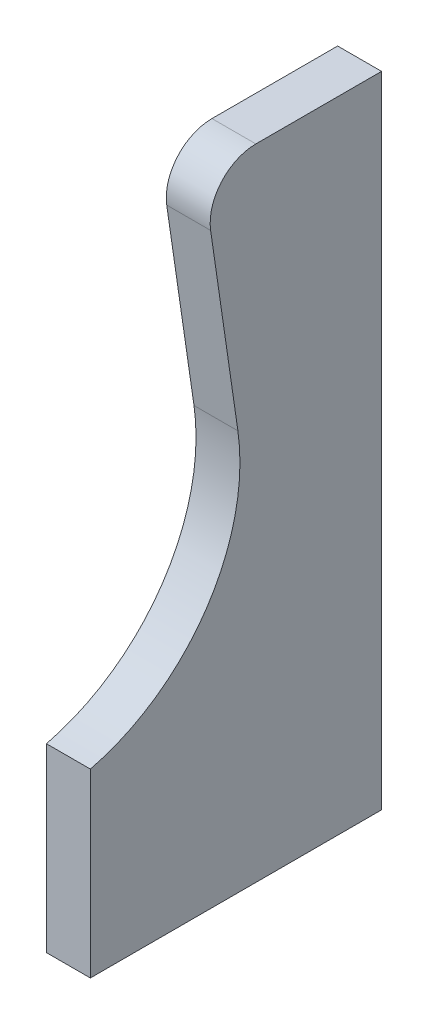
ISO-10303-21;
HEADER;
FILE_DESCRIPTION(('STEP AP214'),'2;1');
FILE_NAME('part.step','',(''),(''),'','','');
FILE_SCHEMA(('AUTOMOTIVE_DESIGN { 1 0 10303 214 1 1 1 1 }'));
ENDSEC;
DATA;
#1=APPLICATION_CONTEXT('core data for automotive mechanical design processes');
#2=APPLICATION_PROTOCOL_DEFINITION('international standard','automotive_design',2000,#1);
#3=PRODUCT_CONTEXT('',#1,'mechanical');
#4=PRODUCT('Part','Part','',(#3));
#5=PRODUCT_RELATED_PRODUCT_CATEGORY('part','',(#4));
#6=PRODUCT_DEFINITION_FORMATION('','',#4);
#7=PRODUCT_DEFINITION_CONTEXT('part definition',#1,'design');
#8=PRODUCT_DEFINITION('design','',#6,#7);
#9=PRODUCT_DEFINITION_SHAPE('','',#8);
#10=(LENGTH_UNIT() NAMED_UNIT(*) SI_UNIT(.MILLI.,.METRE.));
#11=(NAMED_UNIT(*) PLANE_ANGLE_UNIT() SI_UNIT($,.RADIAN.));
#12=(NAMED_UNIT(*) SI_UNIT($,.STERADIAN.) SOLID_ANGLE_UNIT());
#13=UNCERTAINTY_MEASURE_WITH_UNIT(LENGTH_MEASURE(1.E-05),#10,'distance_accuracy_value','');
#14=(GEOMETRIC_REPRESENTATION_CONTEXT(3) GLOBAL_UNCERTAINTY_ASSIGNED_CONTEXT((#13)) GLOBAL_UNIT_ASSIGNED_CONTEXT((#10,
#11,#12)) REPRESENTATION_CONTEXT('',''));
#15=CARTESIAN_POINT('',(0.,0.,0.));
#16=DIRECTION('',(0.,0.,1.));
#17=DIRECTION('',(1.,0.,0.));
#18=AXIS2_PLACEMENT_3D('',#15,#16,#17);
#19=CARTESIAN_POINT('',(-12.0777,7.6962,0.));
#20=DIRECTION('',(1.,0.,0.));
#21=DIRECTION('',(0.,0.,-1.));
#22=AXIS2_PLACEMENT_3D('',#19,#20,#21);
#23=CYLINDRICAL_SURFACE('',#22,2.2733);
#24=CARTESIAN_POINT('',(-7.8359,7.6962,0.));
#25=DIRECTION('',(1.,0.,0.));
#26=DIRECTION('',(0.,1.,0.));
#27=AXIS2_PLACEMENT_3D('',#24,#25,#26);
#28=CIRCLE('',#27,2.2733);
#29=CARTESIAN_POINT('',(-7.8359,5.488565124449,-0.542439993226));
#30=VERTEX_POINT('',#29);
#31=CARTESIAN_POINT('',(-7.8359,8.023846833997,-2.249564500558));
#32=VERTEX_POINT('',#31);
#33=EDGE_CURVE('E169',#30,#32,#28,.T.);
#34=ORIENTED_EDGE('',*,*,#33,.F.);
#35=DIRECTION('',(1.,0.,0.));
#36=VECTOR('',#35,1.);
#37=CARTESIAN_POINT('',(-12.0777,5.488565124449,-0.542439993226));
#38=LINE('',#37,#36);
#39=CARTESIAN_POINT('',(-7.3279,5.488565124449,-0.542439993226));
#40=VERTEX_POINT('',#39);
#41=EDGE_CURVE('E113',#30,#40,#38,.T.);
#42=ORIENTED_EDGE('',*,*,#41,.T.);
#43=CARTESIAN_POINT('',(-7.3279,7.6962,0.));
#44=DIRECTION('',(-1.,0.,0.));
#45=DIRECTION('',(0.,-1.,0.));
#46=AXIS2_PLACEMENT_3D('',#43,#44,#45);
#47=CIRCLE('',#46,2.2733);
#48=CARTESIAN_POINT('',(-7.3279,8.023846833997,-2.249564500558));
#49=VERTEX_POINT('',#48);
#50=EDGE_CURVE('E25',#49,#40,#47,.T.);
#51=ORIENTED_EDGE('',*,*,#50,.F.);
#52=DIRECTION('',(1.,0.,0.));
#53=VECTOR('',#52,1.);
#54=CARTESIAN_POINT('',(-12.0777,8.023846833997,-2.249564500558));
#55=LINE('',#54,#53);
#56=EDGE_CURVE('E130',#32,#49,#55,.T.);
#57=ORIENTED_EDGE('',*,*,#56,.F.);
#58=EDGE_LOOP('',(#34,#42,#51,#57));
#59=FACE_BOUND('',#58,.T.);
#60=ADVANCED_FACE('F17',(#59),#23,.F.);
#61=CARTESIAN_POINT('',(0.,3.395,0.));
#62=DIRECTION('',(0.,1.,0.));
#63=DIRECTION('',(1.,0.,0.));
#64=AXIS2_PLACEMENT_3D('',#61,#62,#63);
#65=PLANE('',#64);
#66=DIRECTION('',(0.,0.,-1.));
#67=VECTOR('',#66,1.);
#68=CARTESIAN_POINT('',(-7.3279,3.395,3.9116));
#69=LINE('',#68,#67);
#70=CARTESIAN_POINT('',(-7.3279,3.395,-0.542439993226));
#71=VERTEX_POINT('',#70);
#72=CARTESIAN_POINT('',(-7.3279,3.395,-3.9116));
#73=VERTEX_POINT('',#72);
#74=EDGE_CURVE('E11',#71,#73,#69,.T.);
#75=ORIENTED_EDGE('',*,*,#74,.F.);
#76=DIRECTION('',(-1.,0.,0.));
#77=VECTOR('',#76,1.);
#78=CARTESIAN_POINT('',(0.,3.395,-0.542439993226));
#79=LINE('',#78,#77);
#80=CARTESIAN_POINT('',(-7.8359,3.395,-0.542439993226));
#81=VERTEX_POINT('',#80);
#82=EDGE_CURVE('E150',#71,#81,#79,.T.);
#83=ORIENTED_EDGE('',*,*,#82,.T.);
#84=DIRECTION('',(0.,0.,1.));
#85=VECTOR('',#84,1.);
#86=CARTESIAN_POINT('',(-7.8359,3.395,3.9116));
#87=LINE('',#86,#85);
#88=CARTESIAN_POINT('',(-7.8359,3.395,-3.9116));
#89=VERTEX_POINT('',#88);
#90=EDGE_CURVE('E156',#89,#81,#87,.T.);
#91=ORIENTED_EDGE('',*,*,#90,.F.);
#92=DIRECTION('',(-1.,0.,0.));
#93=VECTOR('',#92,1.);
#94=CARTESIAN_POINT('',(-7.3279,3.395,-3.9116));
#95=LINE('',#94,#93);
#96=EDGE_CURVE('E103',#73,#89,#95,.T.);
#97=ORIENTED_EDGE('',*,*,#96,.F.);
#98=EDGE_LOOP('',(#75,#83,#91,#97));
#99=FACE_BOUND('',#98,.T.);
#100=ADVANCED_FACE('F187',(#99),#65,.F.);
#101=CARTESIAN_POINT('',(-7.3279,18.634676156577,3.9116));
#102=DIRECTION('',(-1.,0.,0.));
#103=DIRECTION('',(0.,0.,1.));
#104=AXIS2_PLACEMENT_3D('',#101,#102,#103);
#105=PLANE('',#104);
#106=DIRECTION('',(0.,0.,1.));
#107=VECTOR('',#106,1.);
#108=CARTESIAN_POINT('',(-7.3279,10.795,3.9116));
#109=LINE('',#108,#107);
#110=CARTESIAN_POINT('',(-7.3279,10.795,-3.9116));
#111=VERTEX_POINT('',#110);
#112=CARTESIAN_POINT('',(-7.3279,10.795,-2.457439098457));
#113=VERTEX_POINT('',#112);
#114=EDGE_CURVE('E45',#111,#113,#109,.T.);
#115=ORIENTED_EDGE('',*,*,#114,.T.);
#116=CARTESIAN_POINT('',(-7.3279,10.266120724429,-2.457439098457));
#117=DIRECTION('',(1.,0.,0.));
#118=DIRECTION('',(0.,-1.,0.));
#119=AXIS2_PLACEMENT_3D('',#116,#117,#118);
#120=CIRCLE('',#119,0.528879275571);
#121=CARTESIAN_POINT('',(-7.3279,10.189894260607,-1.934081845386));
#122=VERTEX_POINT('',#121);
#123=EDGE_CURVE('E96',#113,#122,#120,.T.);
#124=ORIENTED_EDGE('',*,*,#123,.T.);
#125=DIRECTION('',(0.,-0.989559011374676,-0.144128286630953));
#126=VECTOR('',#125,1.);
#127=CARTESIAN_POINT('',(-7.3279,19.292984296814,-0.608225827827));
#128=LINE('',#127,#126);
#129=EDGE_CURVE('E126',#122,#49,#128,.T.);
#130=ORIENTED_EDGE('',*,*,#129,.T.);
#131=ORIENTED_EDGE('',*,*,#50,.T.);
#132=DIRECTION('',(0.,-1.,0.));
#133=VECTOR('',#132,1.);
#134=CARTESIAN_POINT('',(-7.3279,18.634676156577,-0.542439993226));
#135=LINE('',#134,#133);
#136=EDGE_CURVE('E134',#40,#71,#135,.T.);
#137=ORIENTED_EDGE('',*,*,#136,.T.);
#138=ORIENTED_EDGE('',*,*,#74,.T.);
#139=DIRECTION('',(0.,-1.,0.));
#140=VECTOR('',#139,1.);
#141=CARTESIAN_POINT('',(-7.3279,18.634676156577,-3.9116));
#142=LINE('',#141,#140);
#143=EDGE_CURVE('E99',#111,#73,#142,.T.);
#144=ORIENTED_EDGE('',*,*,#143,.F.);
#145=EDGE_LOOP('',(#115,#124,#130,#131,#137,#138,#144));
#146=FACE_BOUND('',#145,.T.);
#147=ADVANCED_FACE('F94',(#146),#105,.F.);
#148=CARTESIAN_POINT('',(-7.8359,18.634676156577,3.9116));
#149=DIRECTION('',(1.,0.,0.));
#150=DIRECTION('',(0.,-1.,0.));
#151=AXIS2_PLACEMENT_3D('',#148,#149,#150);
#152=PLANE('',#151);
#153=DIRECTION('',(0.,0.989559011374676,0.144128286630953));
#154=VECTOR('',#153,1.);
#155=CARTESIAN_POINT('',(-7.8359,19.292984296814,-0.608225827827));
#156=LINE('',#155,#154);
#157=CARTESIAN_POINT('',(-7.8359,10.189894260607,-1.934081845386));
#158=VERTEX_POINT('',#157);
#159=EDGE_CURVE('E131',#32,#158,#156,.T.);
#160=ORIENTED_EDGE('',*,*,#159,.T.);
#161=CARTESIAN_POINT('',(-7.8359,10.266120724429,-2.457439098457));
#162=DIRECTION('',(-1.,0.,0.));
#163=DIRECTION('',(0.,1.,0.));
#164=AXIS2_PLACEMENT_3D('',#161,#162,#163);
#165=CIRCLE('',#164,0.528879275571);
#166=CARTESIAN_POINT('',(-7.8359,10.795,-2.457439098457));
#167=VERTEX_POINT('',#166);
#168=EDGE_CURVE('E118',#158,#167,#165,.T.);
#169=ORIENTED_EDGE('',*,*,#168,.T.);
#170=DIRECTION('',(0.,0.,-1.));
#171=VECTOR('',#170,1.);
#172=CARTESIAN_POINT('',(-7.8359,10.795,3.9116));
#173=LINE('',#172,#171);
#174=CARTESIAN_POINT('',(-7.8359,10.795,-3.9116));
#175=VERTEX_POINT('',#174);
#176=EDGE_CURVE('E102',#167,#175,#173,.T.);
#177=ORIENTED_EDGE('',*,*,#176,.T.);
#178=DIRECTION('',(0.,-1.,0.));
#179=VECTOR('',#178,1.);
#180=CARTESIAN_POINT('',(-7.8359,18.634676156577,-3.9116));
#181=LINE('',#180,#179);
#182=EDGE_CURVE('E129',#175,#89,#181,.T.);
#183=ORIENTED_EDGE('',*,*,#182,.T.);
#184=ORIENTED_EDGE('',*,*,#90,.T.);
#185=DIRECTION('',(0.,1.,0.));
#186=VECTOR('',#185,1.);
#187=CARTESIAN_POINT('',(-7.8359,18.634676156577,-0.542439993226));
#188=LINE('',#187,#186);
#189=EDGE_CURVE('E146',#81,#30,#188,.T.);
#190=ORIENTED_EDGE('',*,*,#189,.T.);
#191=ORIENTED_EDGE('',*,*,#33,.T.);
#192=EDGE_LOOP('',(#160,#169,#177,#183,#184,#190,#191));
#193=FACE_BOUND('',#192,.T.);
#194=ADVANCED_FACE('F184',(#193),#152,.F.);
#195=CARTESIAN_POINT('',(10.9347,10.795,-3.7084));
#196=DIRECTION('',(0.,-1.,0.));
#197=DIRECTION('',(0.,0.,-1.));
#198=AXIS2_PLACEMENT_3D('',#195,#196,#197);
#199=PLANE('',#198);
#200=DIRECTION('',(-1.,0.,0.));
#201=VECTOR('',#200,1.);
#202=CARTESIAN_POINT('',(-12.0777,10.795,-2.457439098457));
#203=LINE('',#202,#201);
#204=EDGE_CURVE('E109',#113,#167,#203,.T.);
#205=ORIENTED_EDGE('',*,*,#204,.F.);
#206=ORIENTED_EDGE('',*,*,#114,.F.);
#207=DIRECTION('',(1.,0.,0.));
#208=VECTOR('',#207,1.);
#209=CARTESIAN_POINT('',(-7.3279,10.795,-3.9116));
#210=LINE('',#209,#208);
#211=EDGE_CURVE('E139',#175,#111,#210,.T.);
#212=ORIENTED_EDGE('',*,*,#211,.F.);
#213=ORIENTED_EDGE('',*,*,#176,.F.);
#214=EDGE_LOOP('',(#205,#206,#212,#213));
#215=FACE_BOUND('',#214,.T.);
#216=ADVANCED_FACE('F115',(#215),#199,.F.);
#217=CARTESIAN_POINT('',(-7.3279,18.634676156577,-3.9116));
#218=DIRECTION('',(0.,0.,1.));
#219=DIRECTION('',(1.,0.,0.));
#220=AXIS2_PLACEMENT_3D('',#217,#218,#219);
#221=PLANE('',#220);
#222=ORIENTED_EDGE('',*,*,#182,.F.);
#223=ORIENTED_EDGE('',*,*,#211,.T.);
#224=ORIENTED_EDGE('',*,*,#143,.T.);
#225=ORIENTED_EDGE('',*,*,#96,.T.);
#226=EDGE_LOOP('',(#222,#223,#224,#225));
#227=FACE_BOUND('',#226,.T.);
#228=ADVANCED_FACE('F189',(#227),#221,.F.);
#229=CARTESIAN_POINT('',(-12.0777,8.023846833997,-2.249564500558));
#230=DIRECTION('',(0.,0.144128286630953,-0.989559011374676));
#231=DIRECTION('',(-1.,0.,0.));
#232=AXIS2_PLACEMENT_3D('',#229,#230,#231);
#233=PLANE('',#232);
#234=DIRECTION('',(1.,0.,0.));
#235=VECTOR('',#234,1.);
#236=CARTESIAN_POINT('',(-12.0777,10.189894260607,-1.934081845386));
#237=LINE('',#236,#235);
#238=EDGE_CURVE('E111',#158,#122,#237,.T.);
#239=ORIENTED_EDGE('',*,*,#238,.F.);
#240=ORIENTED_EDGE('',*,*,#159,.F.);
#241=ORIENTED_EDGE('',*,*,#56,.T.);
#242=ORIENTED_EDGE('',*,*,#129,.F.);
#243=EDGE_LOOP('',(#239,#240,#241,#242));
#244=FACE_BOUND('',#243,.T.);
#245=ADVANCED_FACE('F191',(#244),#233,.F.);
#246=CARTESIAN_POINT('',(-12.0777,5.488565124449,-0.542439993226));
#247=DIRECTION('',(0.,0.,-1.));
#248=DIRECTION('',(0.,-1.,0.));
#249=AXIS2_PLACEMENT_3D('',#246,#247,#248);
#250=PLANE('',#249);
#251=ORIENTED_EDGE('',*,*,#41,.F.);
#252=ORIENTED_EDGE('',*,*,#189,.F.);
#253=ORIENTED_EDGE('',*,*,#82,.F.);
#254=ORIENTED_EDGE('',*,*,#136,.F.);
#255=EDGE_LOOP('',(#251,#252,#253,#254));
#256=FACE_BOUND('',#255,.T.);
#257=ADVANCED_FACE('F180',(#256),#250,.F.);
#258=CARTESIAN_POINT('',(-12.0777,10.266120724429,-2.457439098457));
#259=DIRECTION('',(1.,0.,0.));
#260=DIRECTION('',(0.,0.,-1.));
#261=AXIS2_PLACEMENT_3D('',#258,#259,#260);
#262=CYLINDRICAL_SURFACE('',#261,0.528879275571);
#263=ORIENTED_EDGE('',*,*,#204,.T.);
#264=ORIENTED_EDGE('',*,*,#168,.F.);
#265=ORIENTED_EDGE('',*,*,#238,.T.);
#266=ORIENTED_EDGE('',*,*,#123,.F.);
#267=EDGE_LOOP('',(#263,#264,#265,#266));
#268=FACE_BOUND('',#267,.T.);
#269=ADVANCED_FACE('F107',(#268),#262,.T.);
#270=CLOSED_SHELL('',(#60,#100,#147,#194,#216,#228,#245,#257,#269));
#271=MANIFOLD_SOLID_BREP('B1',#270);
#272=ADVANCED_BREP_SHAPE_REPRESENTATION('',(#18,#271),#14);
#273=SHAPE_DEFINITION_REPRESENTATION(#9,#272);
ENDSEC;
END-ISO-10303-21;
